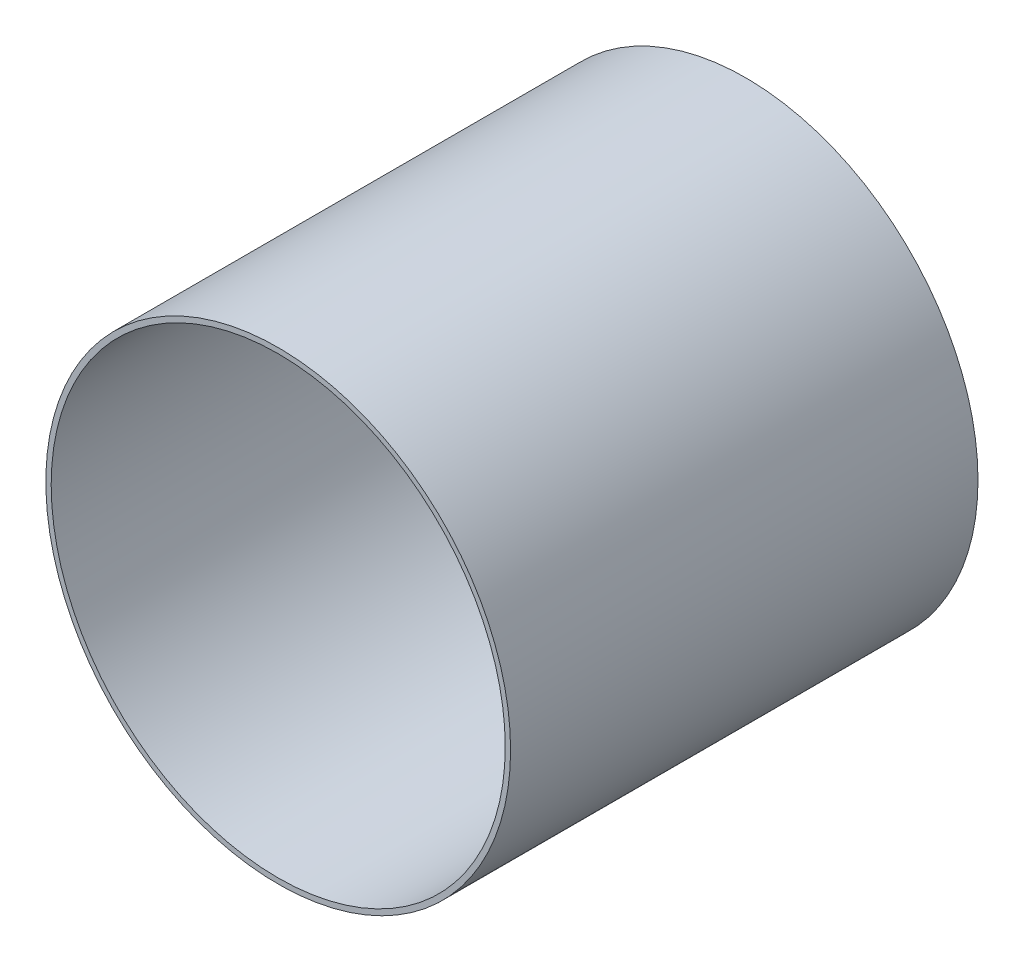
ISO-10303-21;
HEADER;
FILE_DESCRIPTION(('STEP AP214'),'2;1');
FILE_NAME('part.step','',(''),(''),'','','');
FILE_SCHEMA(('AUTOMOTIVE_DESIGN { 1 0 10303 214 1 1 1 1 }'));
ENDSEC;
DATA;
#1=APPLICATION_CONTEXT('core data for automotive mechanical design processes');
#2=APPLICATION_PROTOCOL_DEFINITION('international standard','automotive_design',2000,#1);
#3=PRODUCT_CONTEXT('',#1,'mechanical');
#4=PRODUCT('Part','Part','',(#3));
#5=PRODUCT_RELATED_PRODUCT_CATEGORY('part','',(#4));
#6=PRODUCT_DEFINITION_FORMATION('','',#4);
#7=PRODUCT_DEFINITION_CONTEXT('part definition',#1,'design');
#8=PRODUCT_DEFINITION('design','',#6,#7);
#9=PRODUCT_DEFINITION_SHAPE('','',#8);
#10=(LENGTH_UNIT() NAMED_UNIT(*) SI_UNIT(.MILLI.,.METRE.));
#11=(NAMED_UNIT(*) PLANE_ANGLE_UNIT() SI_UNIT($,.RADIAN.));
#12=(NAMED_UNIT(*) SI_UNIT($,.STERADIAN.) SOLID_ANGLE_UNIT());
#13=UNCERTAINTY_MEASURE_WITH_UNIT(LENGTH_MEASURE(1.E-05),#10,'distance_accuracy_value','');
#14=(GEOMETRIC_REPRESENTATION_CONTEXT(3) GLOBAL_UNCERTAINTY_ASSIGNED_CONTEXT((#13)) GLOBAL_UNIT_ASSIGNED_CONTEXT((#10,
#11,#12)) REPRESENTATION_CONTEXT('',''));
#15=CARTESIAN_POINT('',(0.,0.,0.));
#16=DIRECTION('',(0.,0.,1.));
#17=DIRECTION('',(1.,0.,0.));
#18=AXIS2_PLACEMENT_3D('',#15,#16,#17);
#19=CARTESIAN_POINT('',(0.,0.,87.5));
#20=DIRECTION('',(0.,0.,1.));
#21=DIRECTION('',(1.,0.,0.));
#22=AXIS2_PLACEMENT_3D('',#19,#20,#21);
#23=PLANE('',#22);
#24=CARTESIAN_POINT('',(0.,0.,87.5));
#25=DIRECTION('',(0.,0.,1.));
#26=DIRECTION('',(1.,0.,0.));
#27=AXIS2_PLACEMENT_3D('',#24,#25,#26);
#28=CIRCLE('',#27,43.5);
#29=CARTESIAN_POINT('',(43.5,0.,87.5));
#30=VERTEX_POINT('',#29);
#31=EDGE_CURVE('E10',#30,#30,#28,.T.);
#32=ORIENTED_EDGE('',*,*,#31,.T.);
#33=EDGE_LOOP('',(#32));
#34=FACE_BOUND('',#33,.T.);
#35=CARTESIAN_POINT('',(0.,0.,87.5));
#36=DIRECTION('',(0.,0.,1.));
#37=DIRECTION('',(1.,0.,0.));
#38=AXIS2_PLACEMENT_3D('',#35,#36,#37);
#39=CIRCLE('',#38,42.5);
#40=CARTESIAN_POINT('',(42.5,0.,87.5));
#41=VERTEX_POINT('',#40);
#42=EDGE_CURVE('E42',#41,#41,#39,.T.);
#43=ORIENTED_EDGE('',*,*,#42,.F.);
#44=EDGE_LOOP('',(#43));
#45=FACE_BOUND('',#44,.T.);
#46=ADVANCED_FACE('F31',(#34,#45),#23,.T.);
#47=CARTESIAN_POINT('',(0.,0.,0.));
#48=DIRECTION('',(0.,0.,1.));
#49=DIRECTION('',(1.,0.,0.));
#50=AXIS2_PLACEMENT_3D('',#47,#48,#49);
#51=PLANE('',#50);
#52=CARTESIAN_POINT('',(0.,0.,0.));
#53=DIRECTION('',(0.,0.,1.));
#54=DIRECTION('',(1.,0.,0.));
#55=AXIS2_PLACEMENT_3D('',#52,#53,#54);
#56=CIRCLE('',#55,43.5);
#57=CARTESIAN_POINT('',(43.5,0.,0.));
#58=VERTEX_POINT('',#57);
#59=EDGE_CURVE('E35',#58,#58,#56,.T.);
#60=ORIENTED_EDGE('',*,*,#59,.F.);
#61=EDGE_LOOP('',(#60));
#62=FACE_BOUND('',#61,.T.);
#63=CARTESIAN_POINT('',(0.,0.,0.));
#64=DIRECTION('',(0.,0.,1.));
#65=DIRECTION('',(1.,0.,0.));
#66=AXIS2_PLACEMENT_3D('',#63,#64,#65);
#67=CIRCLE('',#66,42.5);
#68=CARTESIAN_POINT('',(42.5,0.,0.));
#69=VERTEX_POINT('',#68);
#70=EDGE_CURVE('E44',#69,#69,#67,.T.);
#71=ORIENTED_EDGE('',*,*,#70,.T.);
#72=EDGE_LOOP('',(#71));
#73=FACE_BOUND('',#72,.T.);
#74=ADVANCED_FACE('F54',(#62,#73),#51,.F.);
#75=CARTESIAN_POINT('',(0.,0.,87.5));
#76=DIRECTION('',(0.,0.,-1.));
#77=DIRECTION('',(-1.,0.,0.));
#78=AXIS2_PLACEMENT_3D('',#75,#76,#77);
#79=CYLINDRICAL_SURFACE('',#78,43.5);
#80=ORIENTED_EDGE('',*,*,#31,.F.);
#81=EDGE_LOOP('',(#80));
#82=FACE_BOUND('',#81,.T.);
#83=ORIENTED_EDGE('',*,*,#59,.T.);
#84=EDGE_LOOP('',(#83));
#85=FACE_BOUND('',#84,.T.);
#86=ADVANCED_FACE('F33',(#82,#85),#79,.T.);
#87=CARTESIAN_POINT('',(0.,0.,87.5));
#88=DIRECTION('',(0.,0.,-1.));
#89=DIRECTION('',(-1.,0.,0.));
#90=AXIS2_PLACEMENT_3D('',#87,#88,#89);
#91=CYLINDRICAL_SURFACE('',#90,42.5);
#92=ORIENTED_EDGE('',*,*,#42,.T.);
#93=EDGE_LOOP('',(#92));
#94=FACE_BOUND('',#93,.T.);
#95=ORIENTED_EDGE('',*,*,#70,.F.);
#96=EDGE_LOOP('',(#95));
#97=FACE_BOUND('',#96,.T.);
#98=ADVANCED_FACE('F50',(#94,#97),#91,.F.);
#99=CLOSED_SHELL('',(#46,#74,#86,#98));
#100=MANIFOLD_SOLID_BREP('B2',#99);
#101=ADVANCED_BREP_SHAPE_REPRESENTATION('',(#18,#100),#14);
#102=SHAPE_DEFINITION_REPRESENTATION(#9,#101);
ENDSEC;
END-ISO-10303-21;
